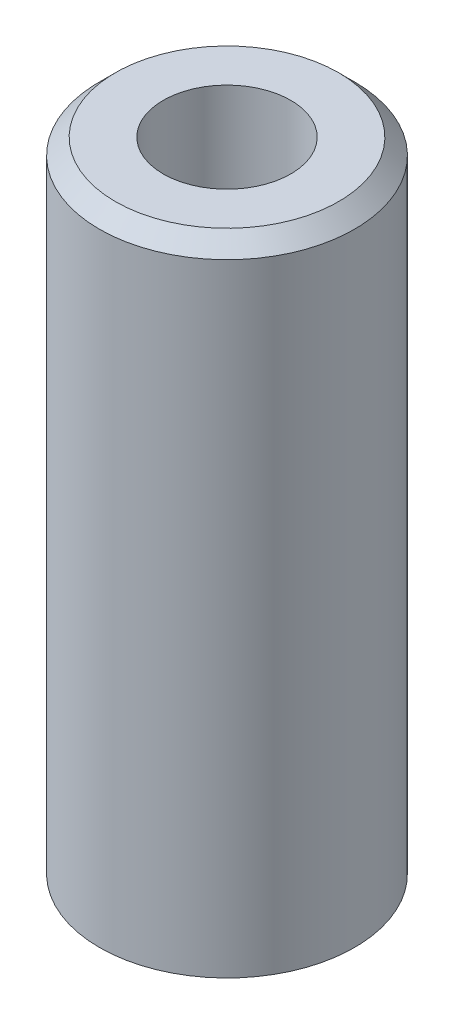
ISO-10303-21;
HEADER;
FILE_DESCRIPTION(('STEP AP214'),'2;1');
FILE_NAME('part.step','',(''),(''),'','','');
FILE_SCHEMA(('AUTOMOTIVE_DESIGN { 1 0 10303 214 1 1 1 1 }'));
ENDSEC;
DATA;
#1=APPLICATION_CONTEXT('core data for automotive mechanical design processes');
#2=APPLICATION_PROTOCOL_DEFINITION('international standard','automotive_design',2000,#1);
#3=PRODUCT_CONTEXT('',#1,'mechanical');
#4=PRODUCT('Part','Part','',(#3));
#5=PRODUCT_RELATED_PRODUCT_CATEGORY('part','',(#4));
#6=PRODUCT_DEFINITION_FORMATION('','',#4);
#7=PRODUCT_DEFINITION_CONTEXT('part definition',#1,'design');
#8=PRODUCT_DEFINITION('design','',#6,#7);
#9=PRODUCT_DEFINITION_SHAPE('','',#8);
#10=(LENGTH_UNIT() NAMED_UNIT(*) SI_UNIT(.MILLI.,.METRE.));
#11=(NAMED_UNIT(*) PLANE_ANGLE_UNIT() SI_UNIT($,.RADIAN.));
#12=(NAMED_UNIT(*) SI_UNIT($,.STERADIAN.) SOLID_ANGLE_UNIT());
#13=UNCERTAINTY_MEASURE_WITH_UNIT(LENGTH_MEASURE(1.E-05),#10,'distance_accuracy_value','');
#14=(GEOMETRIC_REPRESENTATION_CONTEXT(3) GLOBAL_UNCERTAINTY_ASSIGNED_CONTEXT((#13)) GLOBAL_UNIT_ASSIGNED_CONTEXT((#10,
#11,#12)) REPRESENTATION_CONTEXT('',''));
#15=CARTESIAN_POINT('',(0.,0.,0.));
#16=DIRECTION('',(0.,0.,1.));
#17=DIRECTION('',(1.,0.,0.));
#18=AXIS2_PLACEMENT_3D('',#15,#16,#17);
#19=CARTESIAN_POINT('',(0.,20.,0.));
#20=DIRECTION('',(0.,1.,0.));
#21=DIRECTION('',(0.,0.,1.));
#22=AXIS2_PLACEMENT_3D('',#19,#20,#21);
#23=PLANE('',#22);
#24=CARTESIAN_POINT('',(0.,20.,0.));
#25=DIRECTION('',(0.,1.,0.));
#26=DIRECTION('',(0.,0.,1.));
#27=AXIS2_PLACEMENT_3D('',#24,#25,#26);
#28=CIRCLE('',#27,3.5);
#29=CARTESIAN_POINT('',(0.,20.,3.5));
#30=VERTEX_POINT('',#29);
#31=EDGE_CURVE('E56',#30,#30,#28,.T.);
#32=ORIENTED_EDGE('',*,*,#31,.T.);
#33=EDGE_LOOP('',(#32));
#34=FACE_BOUND('',#33,.T.);
#35=CARTESIAN_POINT('',(0.,20.,0.));
#36=DIRECTION('',(0.,1.,0.));
#37=DIRECTION('',(0.,0.,1.));
#38=AXIS2_PLACEMENT_3D('',#35,#36,#37);
#39=CIRCLE('',#38,2.);
#40=CARTESIAN_POINT('',(0.,20.,2.));
#41=VERTEX_POINT('',#40);
#42=EDGE_CURVE('E66',#41,#41,#39,.T.);
#43=ORIENTED_EDGE('',*,*,#42,.F.);
#44=EDGE_LOOP('',(#43));
#45=FACE_BOUND('',#44,.T.);
#46=ADVANCED_FACE('F47',(#34,#45),#23,.T.);
#47=CARTESIAN_POINT('',(0.,0.,0.));
#48=DIRECTION('',(0.,1.,0.));
#49=DIRECTION('',(0.,0.,1.));
#50=AXIS2_PLACEMENT_3D('',#47,#48,#49);
#51=PLANE('',#50);
#52=CARTESIAN_POINT('',(0.,0.,0.));
#53=DIRECTION('',(0.,1.,0.));
#54=DIRECTION('',(0.,0.,1.));
#55=AXIS2_PLACEMENT_3D('',#52,#53,#54);
#56=CIRCLE('',#55,4.);
#57=CARTESIAN_POINT('',(0.,0.,4.));
#58=VERTEX_POINT('',#57);
#59=EDGE_CURVE('E61',#58,#58,#56,.T.);
#60=ORIENTED_EDGE('',*,*,#59,.F.);
#61=EDGE_LOOP('',(#60));
#62=FACE_BOUND('',#61,.T.);
#63=CARTESIAN_POINT('',(0.,0.,0.));
#64=DIRECTION('',(0.,1.,0.));
#65=DIRECTION('',(0.,0.,1.));
#66=AXIS2_PLACEMENT_3D('',#63,#64,#65);
#67=CIRCLE('',#66,2.);
#68=CARTESIAN_POINT('',(0.,0.,2.));
#69=VERTEX_POINT('',#68);
#70=EDGE_CURVE('E69',#69,#69,#67,.T.);
#71=ORIENTED_EDGE('',*,*,#70,.T.);
#72=EDGE_LOOP('',(#71));
#73=FACE_BOUND('',#72,.T.);
#74=ADVANCED_FACE('F81',(#62,#73),#51,.F.);
#75=CARTESIAN_POINT('',(0.,20.,0.));
#76=DIRECTION('',(0.,-1.,0.));
#77=DIRECTION('',(0.,0.,-1.));
#78=AXIS2_PLACEMENT_3D('',#75,#76,#77);
#79=CYLINDRICAL_SURFACE('',#78,4.);
#80=CARTESIAN_POINT('',(0.,19.5,0.));
#81=DIRECTION('',(0.,1.,0.));
#82=DIRECTION('',(0.,0.,1.));
#83=AXIS2_PLACEMENT_3D('',#80,#81,#82);
#84=CIRCLE('',#83,4.);
#85=CARTESIAN_POINT('',(0.,19.5,4.));
#86=VERTEX_POINT('',#85);
#87=EDGE_CURVE('E10',#86,#86,#84,.F.);
#88=ORIENTED_EDGE('',*,*,#87,.T.);
#89=EDGE_LOOP('',(#88));
#90=FACE_BOUND('',#89,.T.);
#91=ORIENTED_EDGE('',*,*,#59,.T.);
#92=EDGE_LOOP('',(#91));
#93=FACE_BOUND('',#92,.T.);
#94=ADVANCED_FACE('F88',(#90,#93),#79,.T.);
#95=CARTESIAN_POINT('',(0.,20.,0.));
#96=DIRECTION('',(0.,-1.,0.));
#97=DIRECTION('',(0.,0.,-1.));
#98=AXIS2_PLACEMENT_3D('',#95,#96,#97);
#99=CYLINDRICAL_SURFACE('',#98,2.);
#100=ORIENTED_EDGE('',*,*,#42,.T.);
#101=EDGE_LOOP('',(#100));
#102=FACE_BOUND('',#101,.T.);
#103=ORIENTED_EDGE('',*,*,#70,.F.);
#104=EDGE_LOOP('',(#103));
#105=FACE_BOUND('',#104,.T.);
#106=ADVANCED_FACE('F77',(#102,#105),#99,.F.);
#107=CARTESIAN_POINT('',(0.,20.,0.));
#108=DIRECTION('',(0.,-1.,0.));
#109=DIRECTION('',(0.,0.,-1.));
#110=AXIS2_PLACEMENT_3D('',#107,#108,#109);
#111=CONICAL_SURFACE('',#110,3.5,0.785398163397445);
#112=ORIENTED_EDGE('',*,*,#87,.F.);
#113=EDGE_LOOP('',(#112));
#114=FACE_BOUND('',#113,.T.);
#115=ORIENTED_EDGE('',*,*,#31,.F.);
#116=EDGE_LOOP('',(#115));
#117=FACE_BOUND('',#116,.T.);
#118=ADVANCED_FACE('F50',(#114,#117),#111,.T.);
#119=CLOSED_SHELL('',(#46,#74,#94,#106,#118));
#120=MANIFOLD_SOLID_BREP('B2',#119);
#121=ADVANCED_BREP_SHAPE_REPRESENTATION('',(#18,#120),#14);
#122=SHAPE_DEFINITION_REPRESENTATION(#9,#121);
ENDSEC;
END-ISO-10303-21;
